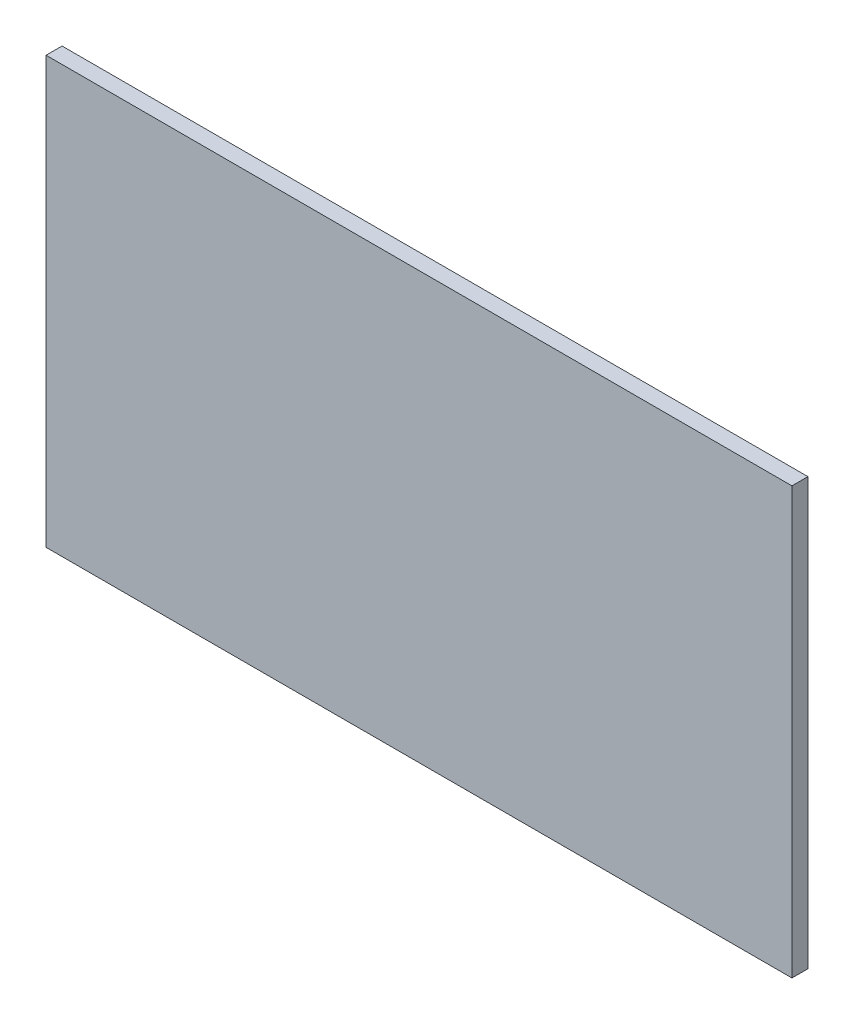
ISO-10303-21;
HEADER;
FILE_DESCRIPTION(('STEP AP214'),'2;1');
FILE_NAME('part.step','',(''),(''),'','','');
FILE_SCHEMA(('AUTOMOTIVE_DESIGN { 1 0 10303 214 1 1 1 1 }'));
ENDSEC;
DATA;
#1=APPLICATION_CONTEXT('core data for automotive mechanical design processes');
#2=APPLICATION_PROTOCOL_DEFINITION('international standard','automotive_design',2000,#1);
#3=PRODUCT_CONTEXT('',#1,'mechanical');
#4=PRODUCT('Part','Part','',(#3));
#5=PRODUCT_RELATED_PRODUCT_CATEGORY('part','',(#4));
#6=PRODUCT_DEFINITION_FORMATION('','',#4);
#7=PRODUCT_DEFINITION_CONTEXT('part definition',#1,'design');
#8=PRODUCT_DEFINITION('design','',#6,#7);
#9=PRODUCT_DEFINITION_SHAPE('','',#8);
#10=(LENGTH_UNIT() NAMED_UNIT(*) SI_UNIT(.MILLI.,.METRE.));
#11=(NAMED_UNIT(*) PLANE_ANGLE_UNIT() SI_UNIT($,.RADIAN.));
#12=(NAMED_UNIT(*) SI_UNIT($,.STERADIAN.) SOLID_ANGLE_UNIT());
#13=UNCERTAINTY_MEASURE_WITH_UNIT(LENGTH_MEASURE(1.E-05),#10,'distance_accuracy_value','');
#14=(GEOMETRIC_REPRESENTATION_CONTEXT(3) GLOBAL_UNCERTAINTY_ASSIGNED_CONTEXT((#13)) GLOBAL_UNIT_ASSIGNED_CONTEXT((#10,
#11,#12)) REPRESENTATION_CONTEXT('',''));
#15=CARTESIAN_POINT('',(0.,0.,0.));
#16=DIRECTION('',(0.,0.,1.));
#17=DIRECTION('',(1.,0.,0.));
#18=AXIS2_PLACEMENT_3D('',#15,#16,#17);
#19=CARTESIAN_POINT('',(-35.,20.,-1.5));
#20=DIRECTION('',(-1.,0.,0.));
#21=DIRECTION('',(0.,0.,1.));
#22=AXIS2_PLACEMENT_3D('',#19,#20,#21);
#23=PLANE('',#22);
#24=DIRECTION('',(0.,-1.,0.));
#25=VECTOR('',#24,1.);
#26=CARTESIAN_POINT('',(-35.,20.,0.));
#27=LINE('',#26,#25);
#28=CARTESIAN_POINT('',(-35.,20.,0.));
#29=VERTEX_POINT('',#28);
#30=CARTESIAN_POINT('',(-35.,-20.,0.));
#31=VERTEX_POINT('',#30);
#32=EDGE_CURVE('E125',#29,#31,#27,.T.);
#33=ORIENTED_EDGE('',*,*,#32,.F.);
#34=DIRECTION('',(0.,0.,1.));
#35=VECTOR('',#34,1.);
#36=CARTESIAN_POINT('',(-35.,20.,-1.5));
#37=LINE('',#36,#35);
#38=CARTESIAN_POINT('',(-35.,20.,-1.5));
#39=VERTEX_POINT('',#38);
#40=EDGE_CURVE('E11',#39,#29,#37,.T.);
#41=ORIENTED_EDGE('',*,*,#40,.F.);
#42=DIRECTION('',(0.,-1.,0.));
#43=VECTOR('',#42,1.);
#44=CARTESIAN_POINT('',(-35.,20.,-1.5));
#45=LINE('',#44,#43);
#46=CARTESIAN_POINT('',(-35.,-20.,-1.5));
#47=VERTEX_POINT('',#46);
#48=EDGE_CURVE('E116',#39,#47,#45,.T.);
#49=ORIENTED_EDGE('',*,*,#48,.T.);
#50=DIRECTION('',(0.,0.,1.));
#51=VECTOR('',#50,1.);
#52=CARTESIAN_POINT('',(-35.,-20.,-1.5));
#53=LINE('',#52,#51);
#54=EDGE_CURVE('E57',#47,#31,#53,.T.);
#55=ORIENTED_EDGE('',*,*,#54,.T.);
#56=EDGE_LOOP('',(#33,#41,#49,#55));
#57=FACE_BOUND('',#56,.T.);
#58=ADVANCED_FACE('F53',(#57),#23,.T.);
#59=CARTESIAN_POINT('',(35.,20.,-1.5));
#60=DIRECTION('',(0.,1.,0.));
#61=DIRECTION('',(0.,0.,1.));
#62=AXIS2_PLACEMENT_3D('',#59,#60,#61);
#63=PLANE('',#62);
#64=DIRECTION('',(-1.,0.,0.));
#65=VECTOR('',#64,1.);
#66=CARTESIAN_POINT('',(35.,20.,0.));
#67=LINE('',#66,#65);
#68=CARTESIAN_POINT('',(35.,20.,0.));
#69=VERTEX_POINT('',#68);
#70=EDGE_CURVE('E120',#69,#29,#67,.T.);
#71=ORIENTED_EDGE('',*,*,#70,.F.);
#72=DIRECTION('',(0.,0.,1.));
#73=VECTOR('',#72,1.);
#74=CARTESIAN_POINT('',(35.,20.,-1.5));
#75=LINE('',#74,#73);
#76=CARTESIAN_POINT('',(35.,20.,-1.5));
#77=VERTEX_POINT('',#76);
#78=EDGE_CURVE('E64',#77,#69,#75,.T.);
#79=ORIENTED_EDGE('',*,*,#78,.F.);
#80=DIRECTION('',(-1.,0.,0.));
#81=VECTOR('',#80,1.);
#82=CARTESIAN_POINT('',(35.,20.,-1.5));
#83=LINE('',#82,#81);
#84=EDGE_CURVE('E111',#77,#39,#83,.T.);
#85=ORIENTED_EDGE('',*,*,#84,.T.);
#86=ORIENTED_EDGE('',*,*,#40,.T.);
#87=EDGE_LOOP('',(#71,#79,#85,#86));
#88=FACE_BOUND('',#87,.T.);
#89=ADVANCED_FACE('F139',(#88),#63,.T.);
#90=CARTESIAN_POINT('',(35.,-20.,-1.5));
#91=DIRECTION('',(1.,0.,0.));
#92=DIRECTION('',(0.,0.,-1.));
#93=AXIS2_PLACEMENT_3D('',#90,#91,#92);
#94=PLANE('',#93);
#95=DIRECTION('',(0.,1.,0.));
#96=VECTOR('',#95,1.);
#97=CARTESIAN_POINT('',(35.,-20.,0.));
#98=LINE('',#97,#96);
#99=CARTESIAN_POINT('',(35.,-20.,0.));
#100=VERTEX_POINT('',#99);
#101=EDGE_CURVE('E105',#100,#69,#98,.T.);
#102=ORIENTED_EDGE('',*,*,#101,.F.);
#103=DIRECTION('',(0.,0.,1.));
#104=VECTOR('',#103,1.);
#105=CARTESIAN_POINT('',(35.,-20.,-1.5));
#106=LINE('',#105,#104);
#107=CARTESIAN_POINT('',(35.,-20.,-1.5));
#108=VERTEX_POINT('',#107);
#109=EDGE_CURVE('E100',#108,#100,#106,.T.);
#110=ORIENTED_EDGE('',*,*,#109,.F.);
#111=DIRECTION('',(0.,1.,0.));
#112=VECTOR('',#111,1.);
#113=CARTESIAN_POINT('',(35.,-20.,-1.5));
#114=LINE('',#113,#112);
#115=EDGE_CURVE('E103',#108,#77,#114,.T.);
#116=ORIENTED_EDGE('',*,*,#115,.T.);
#117=ORIENTED_EDGE('',*,*,#78,.T.);
#118=EDGE_LOOP('',(#102,#110,#116,#117));
#119=FACE_BOUND('',#118,.T.);
#120=ADVANCED_FACE('F102',(#119),#94,.T.);
#121=CARTESIAN_POINT('',(-35.,-20.,-1.5));
#122=DIRECTION('',(0.,-1.,0.));
#123=DIRECTION('',(0.,0.,-1.));
#124=AXIS2_PLACEMENT_3D('',#121,#122,#123);
#125=PLANE('',#124);
#126=DIRECTION('',(1.,0.,0.));
#127=VECTOR('',#126,1.);
#128=CARTESIAN_POINT('',(-35.,-20.,0.));
#129=LINE('',#128,#127);
#130=EDGE_CURVE('E128',#31,#100,#129,.T.);
#131=ORIENTED_EDGE('',*,*,#130,.F.);
#132=ORIENTED_EDGE('',*,*,#54,.F.);
#133=DIRECTION('',(1.,0.,0.));
#134=VECTOR('',#133,1.);
#135=CARTESIAN_POINT('',(-35.,-20.,-1.5));
#136=LINE('',#135,#134);
#137=EDGE_CURVE('E110',#47,#108,#136,.T.);
#138=ORIENTED_EDGE('',*,*,#137,.T.);
#139=ORIENTED_EDGE('',*,*,#109,.T.);
#140=EDGE_LOOP('',(#131,#132,#138,#139));
#141=FACE_BOUND('',#140,.T.);
#142=ADVANCED_FACE('F114',(#141),#125,.T.);
#143=CARTESIAN_POINT('',(0.,0.,-1.5));
#144=DIRECTION('',(0.,0.,1.));
#145=DIRECTION('',(1.,0.,0.));
#146=AXIS2_PLACEMENT_3D('',#143,#144,#145);
#147=PLANE('',#146);
#148=ORIENTED_EDGE('',*,*,#48,.F.);
#149=ORIENTED_EDGE('',*,*,#84,.F.);
#150=ORIENTED_EDGE('',*,*,#115,.F.);
#151=ORIENTED_EDGE('',*,*,#137,.F.);
#152=EDGE_LOOP('',(#148,#149,#150,#151));
#153=FACE_BOUND('',#152,.T.);
#154=ADVANCED_FACE('F109',(#153),#147,.F.);
#155=CARTESIAN_POINT('',(0.,0.,0.));
#156=DIRECTION('',(0.,0.,1.));
#157=DIRECTION('',(1.,0.,0.));
#158=AXIS2_PLACEMENT_3D('',#155,#156,#157);
#159=PLANE('',#158);
#160=ORIENTED_EDGE('',*,*,#32,.T.);
#161=ORIENTED_EDGE('',*,*,#130,.T.);
#162=ORIENTED_EDGE('',*,*,#101,.T.);
#163=ORIENTED_EDGE('',*,*,#70,.T.);
#164=EDGE_LOOP('',(#160,#161,#162,#163));
#165=FACE_BOUND('',#164,.T.);
#166=ADVANCED_FACE('F138',(#165),#159,.T.);
#167=CLOSED_SHELL('',(#58,#89,#120,#142,#154,#166));
#168=MANIFOLD_SOLID_BREP('B2',#167);
#169=ADVANCED_BREP_SHAPE_REPRESENTATION('',(#18,#168),#14);
#170=SHAPE_DEFINITION_REPRESENTATION(#9,#169);
ENDSEC;
END-ISO-10303-21;
